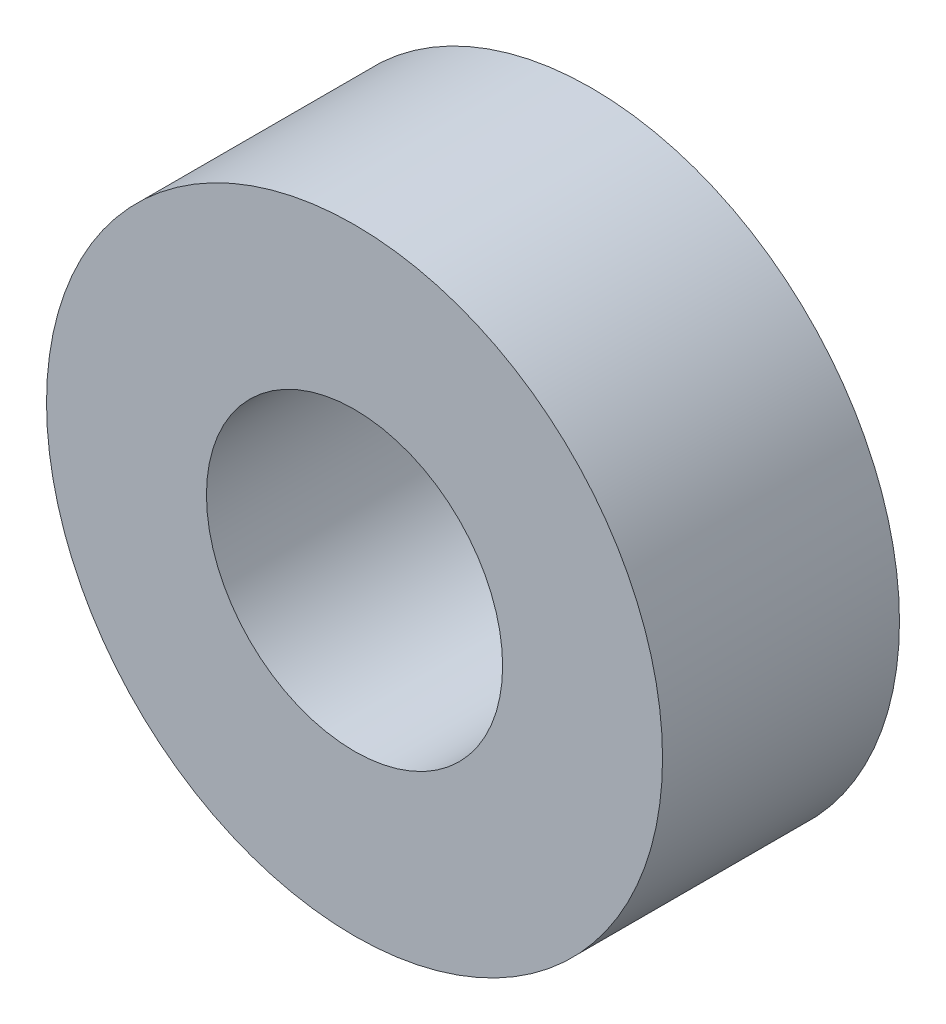
ISO-10303-21;
HEADER;
FILE_DESCRIPTION(('STEP AP214'),'2;1');
FILE_NAME('part.step','',(''),(''),'','','');
FILE_SCHEMA(('AUTOMOTIVE_DESIGN { 1 0 10303 214 1 1 1 1 }'));
ENDSEC;
DATA;
#1=APPLICATION_CONTEXT('core data for automotive mechanical design processes');
#2=APPLICATION_PROTOCOL_DEFINITION('international standard','automotive_design',2000,#1);
#3=PRODUCT_CONTEXT('',#1,'mechanical');
#4=PRODUCT('Part','Part','',(#3));
#5=PRODUCT_RELATED_PRODUCT_CATEGORY('part','',(#4));
#6=PRODUCT_DEFINITION_FORMATION('','',#4);
#7=PRODUCT_DEFINITION_CONTEXT('part definition',#1,'design');
#8=PRODUCT_DEFINITION('design','',#6,#7);
#9=PRODUCT_DEFINITION_SHAPE('','',#8);
#10=(LENGTH_UNIT() NAMED_UNIT(*) SI_UNIT(.MILLI.,.METRE.));
#11=(NAMED_UNIT(*) PLANE_ANGLE_UNIT() SI_UNIT($,.RADIAN.));
#12=(NAMED_UNIT(*) SI_UNIT($,.STERADIAN.) SOLID_ANGLE_UNIT());
#13=UNCERTAINTY_MEASURE_WITH_UNIT(LENGTH_MEASURE(1.E-05),#10,'distance_accuracy_value','');
#14=(GEOMETRIC_REPRESENTATION_CONTEXT(3) GLOBAL_UNCERTAINTY_ASSIGNED_CONTEXT((#13)) GLOBAL_UNIT_ASSIGNED_CONTEXT((#10,
#11,#12)) REPRESENTATION_CONTEXT('',''));
#15=CARTESIAN_POINT('',(0.,0.,0.));
#16=DIRECTION('',(0.,0.,1.));
#17=DIRECTION('',(1.,0.,0.));
#18=AXIS2_PLACEMENT_3D('',#15,#16,#17);
#19=CARTESIAN_POINT('',(0.,0.,10.));
#20=DIRECTION('',(0.,0.,1.));
#21=DIRECTION('',(1.,0.,0.));
#22=AXIS2_PLACEMENT_3D('',#19,#20,#21);
#23=PLANE('',#22);
#24=CARTESIAN_POINT('',(0.,0.,10.));
#25=DIRECTION('',(0.,0.,1.));
#26=DIRECTION('',(1.,0.,0.));
#27=AXIS2_PLACEMENT_3D('',#24,#25,#26);
#28=CIRCLE('',#27,13.);
#29=CARTESIAN_POINT('',(13.,0.,10.));
#30=VERTEX_POINT('',#29);
#31=EDGE_CURVE('E10',#30,#30,#28,.T.);
#32=ORIENTED_EDGE('',*,*,#31,.T.);
#33=EDGE_LOOP('',(#32));
#34=FACE_BOUND('',#33,.T.);
#35=CARTESIAN_POINT('',(0.,0.,10.));
#36=DIRECTION('',(0.,0.,1.));
#37=DIRECTION('',(1.,0.,0.));
#38=AXIS2_PLACEMENT_3D('',#35,#36,#37);
#39=CIRCLE('',#38,6.25);
#40=CARTESIAN_POINT('',(6.25,0.,10.));
#41=VERTEX_POINT('',#40);
#42=EDGE_CURVE('E42',#41,#41,#39,.T.);
#43=ORIENTED_EDGE('',*,*,#42,.F.);
#44=EDGE_LOOP('',(#43));
#45=FACE_BOUND('',#44,.T.);
#46=ADVANCED_FACE('F31',(#34,#45),#23,.T.);
#47=CARTESIAN_POINT('',(0.,0.,0.));
#48=DIRECTION('',(0.,0.,1.));
#49=DIRECTION('',(1.,0.,0.));
#50=AXIS2_PLACEMENT_3D('',#47,#48,#49);
#51=PLANE('',#50);
#52=CARTESIAN_POINT('',(0.,0.,0.));
#53=DIRECTION('',(0.,0.,1.));
#54=DIRECTION('',(1.,0.,0.));
#55=AXIS2_PLACEMENT_3D('',#52,#53,#54);
#56=CIRCLE('',#55,13.);
#57=CARTESIAN_POINT('',(13.,0.,0.));
#58=VERTEX_POINT('',#57);
#59=EDGE_CURVE('E35',#58,#58,#56,.T.);
#60=ORIENTED_EDGE('',*,*,#59,.F.);
#61=EDGE_LOOP('',(#60));
#62=FACE_BOUND('',#61,.T.);
#63=CARTESIAN_POINT('',(0.,0.,0.));
#64=DIRECTION('',(0.,0.,1.));
#65=DIRECTION('',(1.,0.,0.));
#66=AXIS2_PLACEMENT_3D('',#63,#64,#65);
#67=CIRCLE('',#66,6.25);
#68=CARTESIAN_POINT('',(6.25,0.,0.));
#69=VERTEX_POINT('',#68);
#70=EDGE_CURVE('E44',#69,#69,#67,.T.);
#71=ORIENTED_EDGE('',*,*,#70,.T.);
#72=EDGE_LOOP('',(#71));
#73=FACE_BOUND('',#72,.T.);
#74=ADVANCED_FACE('F54',(#62,#73),#51,.F.);
#75=CARTESIAN_POINT('',(0.,0.,10.));
#76=DIRECTION('',(0.,0.,-1.));
#77=DIRECTION('',(-1.,0.,0.));
#78=AXIS2_PLACEMENT_3D('',#75,#76,#77);
#79=CYLINDRICAL_SURFACE('',#78,13.);
#80=ORIENTED_EDGE('',*,*,#31,.F.);
#81=EDGE_LOOP('',(#80));
#82=FACE_BOUND('',#81,.T.);
#83=ORIENTED_EDGE('',*,*,#59,.T.);
#84=EDGE_LOOP('',(#83));
#85=FACE_BOUND('',#84,.T.);
#86=ADVANCED_FACE('F33',(#82,#85),#79,.T.);
#87=CARTESIAN_POINT('',(0.,0.,10.));
#88=DIRECTION('',(0.,0.,-1.));
#89=DIRECTION('',(-1.,0.,0.));
#90=AXIS2_PLACEMENT_3D('',#87,#88,#89);
#91=CYLINDRICAL_SURFACE('',#90,6.25);
#92=ORIENTED_EDGE('',*,*,#42,.T.);
#93=EDGE_LOOP('',(#92));
#94=FACE_BOUND('',#93,.T.);
#95=ORIENTED_EDGE('',*,*,#70,.F.);
#96=EDGE_LOOP('',(#95));
#97=FACE_BOUND('',#96,.T.);
#98=ADVANCED_FACE('F50',(#94,#97),#91,.F.);
#99=CLOSED_SHELL('',(#46,#74,#86,#98));
#100=MANIFOLD_SOLID_BREP('B2',#99);
#101=ADVANCED_BREP_SHAPE_REPRESENTATION('',(#18,#100),#14);
#102=SHAPE_DEFINITION_REPRESENTATION(#9,#101);
ENDSEC;
END-ISO-10303-21;
